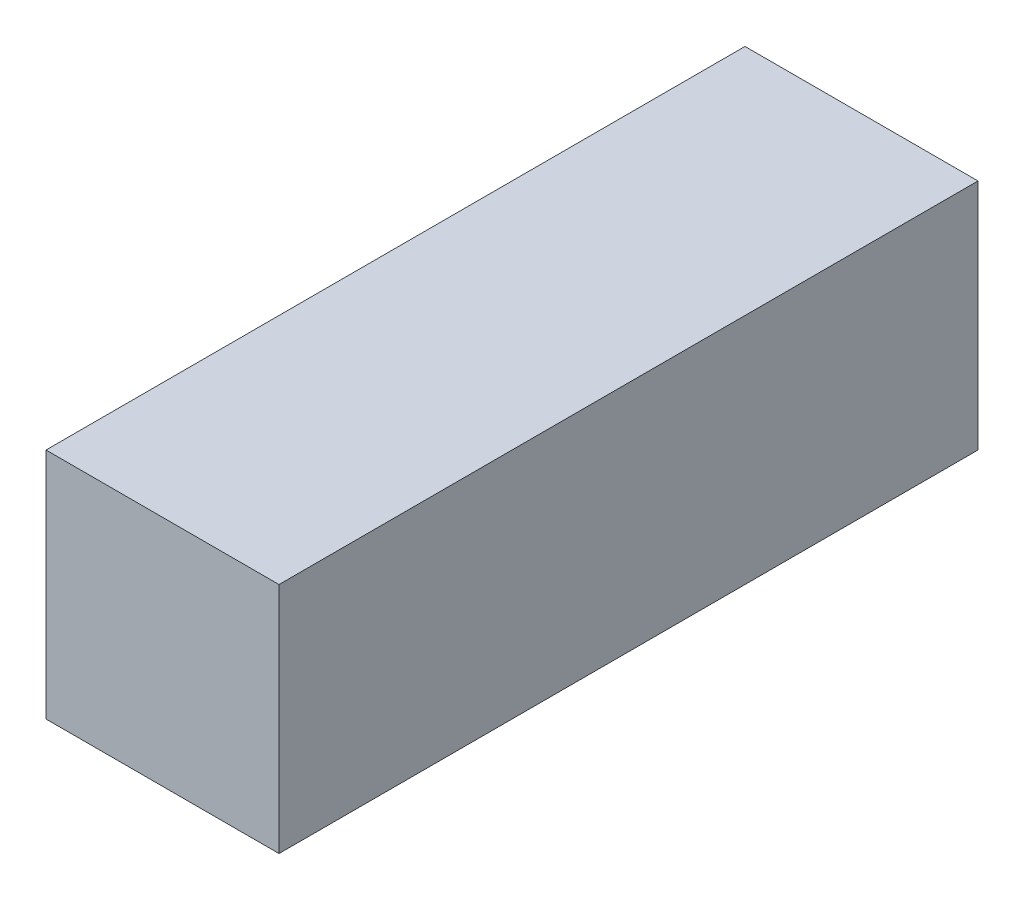
ISO-10303-21;
HEADER;
FILE_DESCRIPTION(('STEP AP214'),'2;1');
FILE_NAME('part.step','',(''),(''),'','','');
FILE_SCHEMA(('AUTOMOTIVE_DESIGN { 1 0 10303 214 1 1 1 1 }'));
ENDSEC;
DATA;
#1=APPLICATION_CONTEXT('core data for automotive mechanical design processes');
#2=APPLICATION_PROTOCOL_DEFINITION('international standard','automotive_design',2000,#1);
#3=PRODUCT_CONTEXT('',#1,'mechanical');
#4=PRODUCT('Part','Part','',(#3));
#5=PRODUCT_RELATED_PRODUCT_CATEGORY('part','',(#4));
#6=PRODUCT_DEFINITION_FORMATION('','',#4);
#7=PRODUCT_DEFINITION_CONTEXT('part definition',#1,'design');
#8=PRODUCT_DEFINITION('design','',#6,#7);
#9=PRODUCT_DEFINITION_SHAPE('','',#8);
#10=(LENGTH_UNIT() NAMED_UNIT(*) SI_UNIT(.MILLI.,.METRE.));
#11=(NAMED_UNIT(*) PLANE_ANGLE_UNIT() SI_UNIT($,.RADIAN.));
#12=(NAMED_UNIT(*) SI_UNIT($,.STERADIAN.) SOLID_ANGLE_UNIT());
#13=UNCERTAINTY_MEASURE_WITH_UNIT(LENGTH_MEASURE(1.E-05),#10,'distance_accuracy_value','');
#14=(GEOMETRIC_REPRESENTATION_CONTEXT(3) GLOBAL_UNCERTAINTY_ASSIGNED_CONTEXT((#13)) GLOBAL_UNIT_ASSIGNED_CONTEXT((#10,
#11,#12)) REPRESENTATION_CONTEXT('',''));
#15=CARTESIAN_POINT('',(0.,0.,0.));
#16=DIRECTION('',(0.,0.,1.));
#17=DIRECTION('',(1.,0.,0.));
#18=AXIS2_PLACEMENT_3D('',#15,#16,#17);
#19=CARTESIAN_POINT('',(-41.7218543046357,26.4900662251656,300.));
#20=DIRECTION('',(1.,0.,0.));
#21=DIRECTION('',(0.,1.,0.));
#22=AXIS2_PLACEMENT_3D('',#19,#20,#21);
#23=PLANE('',#22);
#24=DIRECTION('',(0.,-1.,0.));
#25=VECTOR('',#24,1.);
#26=CARTESIAN_POINT('',(-41.7218543046357,26.4900662251656,0.));
#27=LINE('',#26,#25);
#28=CARTESIAN_POINT('',(-41.7218543046357,26.4900662251656,0.));
#29=VERTEX_POINT('',#28);
#30=CARTESIAN_POINT('',(-41.7218543046357,-73.5099337748344,0.));
#31=VERTEX_POINT('',#30);
#32=EDGE_CURVE('E99',#29,#31,#27,.T.);
#33=ORIENTED_EDGE('',*,*,#32,.T.);
#34=DIRECTION('',(0.,0.,-1.));
#35=VECTOR('',#34,1.);
#36=CARTESIAN_POINT('',(-41.7218543046357,-73.5099337748344,300.));
#37=LINE('',#36,#35);
#38=CARTESIAN_POINT('',(-41.7218543046357,-73.5099337748344,300.));
#39=VERTEX_POINT('',#38);
#40=EDGE_CURVE('E11',#39,#31,#37,.T.);
#41=ORIENTED_EDGE('',*,*,#40,.F.);
#42=DIRECTION('',(0.,-1.,0.));
#43=VECTOR('',#42,1.);
#44=CARTESIAN_POINT('',(-41.7218543046357,26.4900662251656,300.));
#45=LINE('',#44,#43);
#46=CARTESIAN_POINT('',(-41.7218543046357,26.4900662251656,300.));
#47=VERTEX_POINT('',#46);
#48=EDGE_CURVE('E87',#47,#39,#45,.T.);
#49=ORIENTED_EDGE('',*,*,#48,.F.);
#50=DIRECTION('',(0.,0.,-1.));
#51=VECTOR('',#50,1.);
#52=CARTESIAN_POINT('',(-41.7218543046357,26.4900662251656,300.));
#53=LINE('',#52,#51);
#54=EDGE_CURVE('E95',#47,#29,#53,.T.);
#55=ORIENTED_EDGE('',*,*,#54,.T.);
#56=EDGE_LOOP('',(#33,#41,#49,#55));
#57=FACE_BOUND('',#56,.T.);
#58=ADVANCED_FACE('F36',(#57),#23,.F.);
#59=CARTESIAN_POINT('',(-41.7218543046357,-73.5099337748344,300.));
#60=DIRECTION('',(0.,1.,0.));
#61=DIRECTION('',(0.,0.,1.));
#62=AXIS2_PLACEMENT_3D('',#59,#60,#61);
#63=PLANE('',#62);
#64=DIRECTION('',(1.,0.,0.));
#65=VECTOR('',#64,1.);
#66=CARTESIAN_POINT('',(-41.7218543046357,-73.5099337748344,0.));
#67=LINE('',#66,#65);
#68=CARTESIAN_POINT('',(58.2781456953643,-73.5099337748344,0.));
#69=VERTEX_POINT('',#68);
#70=EDGE_CURVE('E91',#31,#69,#67,.T.);
#71=ORIENTED_EDGE('',*,*,#70,.T.);
#72=DIRECTION('',(0.,0.,-1.));
#73=VECTOR('',#72,1.);
#74=CARTESIAN_POINT('',(58.2781456953643,-73.5099337748344,300.));
#75=LINE('',#74,#73);
#76=CARTESIAN_POINT('',(58.2781456953643,-73.5099337748344,300.));
#77=VERTEX_POINT('',#76);
#78=EDGE_CURVE('E44',#77,#69,#75,.T.);
#79=ORIENTED_EDGE('',*,*,#78,.F.);
#80=DIRECTION('',(1.,0.,0.));
#81=VECTOR('',#80,1.);
#82=CARTESIAN_POINT('',(-41.7218543046357,-73.5099337748344,300.));
#83=LINE('',#82,#81);
#84=EDGE_CURVE('E82',#39,#77,#83,.T.);
#85=ORIENTED_EDGE('',*,*,#84,.F.);
#86=ORIENTED_EDGE('',*,*,#40,.T.);
#87=EDGE_LOOP('',(#71,#79,#85,#86));
#88=FACE_BOUND('',#87,.T.);
#89=ADVANCED_FACE('F90',(#88),#63,.F.);
#90=CARTESIAN_POINT('',(58.2781456953643,26.4900662251656,300.));
#91=DIRECTION('',(-1.,0.,0.));
#92=DIRECTION('',(0.,-1.,0.));
#93=AXIS2_PLACEMENT_3D('',#90,#91,#92);
#94=PLANE('',#93);
#95=DIRECTION('',(0.,1.,0.));
#96=VECTOR('',#95,1.);
#97=CARTESIAN_POINT('',(58.2781456953643,26.4900662251656,0.));
#98=LINE('',#97,#96);
#99=CARTESIAN_POINT('',(58.2781456953643,26.4900662251656,0.));
#100=VERTEX_POINT('',#99);
#101=EDGE_CURVE('E69',#69,#100,#98,.T.);
#102=ORIENTED_EDGE('',*,*,#101,.T.);
#103=DIRECTION('',(0.,0.,-1.));
#104=VECTOR('',#103,1.);
#105=CARTESIAN_POINT('',(58.2781456953643,26.4900662251656,300.));
#106=LINE('',#105,#104);
#107=CARTESIAN_POINT('',(58.2781456953643,26.4900662251656,300.));
#108=VERTEX_POINT('',#107);
#109=EDGE_CURVE('E92',#108,#100,#106,.T.);
#110=ORIENTED_EDGE('',*,*,#109,.F.);
#111=DIRECTION('',(0.,1.,0.));
#112=VECTOR('',#111,1.);
#113=CARTESIAN_POINT('',(58.2781456953643,26.4900662251656,300.));
#114=LINE('',#113,#112);
#115=EDGE_CURVE('E85',#77,#108,#114,.T.);
#116=ORIENTED_EDGE('',*,*,#115,.F.);
#117=ORIENTED_EDGE('',*,*,#78,.T.);
#118=EDGE_LOOP('',(#102,#110,#116,#117));
#119=FACE_BOUND('',#118,.T.);
#120=ADVANCED_FACE('F93',(#119),#94,.F.);
#121=CARTESIAN_POINT('',(-41.7218543046357,26.4900662251656,300.));
#122=DIRECTION('',(0.,-1.,0.));
#123=DIRECTION('',(0.,0.,-1.));
#124=AXIS2_PLACEMENT_3D('',#121,#122,#123);
#125=PLANE('',#124);
#126=DIRECTION('',(-1.,0.,0.));
#127=VECTOR('',#126,1.);
#128=CARTESIAN_POINT('',(-41.7218543046357,26.4900662251656,0.));
#129=LINE('',#128,#127);
#130=EDGE_CURVE('E75',#100,#29,#129,.T.);
#131=ORIENTED_EDGE('',*,*,#130,.T.);
#132=ORIENTED_EDGE('',*,*,#54,.F.);
#133=DIRECTION('',(-1.,0.,0.));
#134=VECTOR('',#133,1.);
#135=CARTESIAN_POINT('',(-41.7218543046357,26.4900662251656,300.));
#136=LINE('',#135,#134);
#137=EDGE_CURVE('E52',#108,#47,#136,.T.);
#138=ORIENTED_EDGE('',*,*,#137,.F.);
#139=ORIENTED_EDGE('',*,*,#109,.T.);
#140=EDGE_LOOP('',(#131,#132,#138,#139));
#141=FACE_BOUND('',#140,.T.);
#142=ADVANCED_FACE('F106',(#141),#125,.F.);
#143=CARTESIAN_POINT('',(0.,0.,300.));
#144=DIRECTION('',(0.,0.,1.));
#145=DIRECTION('',(1.,0.,0.));
#146=AXIS2_PLACEMENT_3D('',#143,#144,#145);
#147=PLANE('',#146);
#148=ORIENTED_EDGE('',*,*,#48,.T.);
#149=ORIENTED_EDGE('',*,*,#84,.T.);
#150=ORIENTED_EDGE('',*,*,#115,.T.);
#151=ORIENTED_EDGE('',*,*,#137,.T.);
#152=EDGE_LOOP('',(#148,#149,#150,#151));
#153=FACE_BOUND('',#152,.T.);
#154=ADVANCED_FACE('F83',(#153),#147,.T.);
#155=CARTESIAN_POINT('',(0.,0.,0.));
#156=DIRECTION('',(0.,0.,1.));
#157=DIRECTION('',(1.,0.,0.));
#158=AXIS2_PLACEMENT_3D('',#155,#156,#157);
#159=PLANE('',#158);
#160=ORIENTED_EDGE('',*,*,#32,.F.);
#161=ORIENTED_EDGE('',*,*,#130,.F.);
#162=ORIENTED_EDGE('',*,*,#101,.F.);
#163=ORIENTED_EDGE('',*,*,#70,.F.);
#164=EDGE_LOOP('',(#160,#161,#162,#163));
#165=FACE_BOUND('',#164,.T.);
#166=ADVANCED_FACE('F109',(#165),#159,.F.);
#167=CLOSED_SHELL('',(#58,#89,#120,#142,#154,#166));
#168=MANIFOLD_SOLID_BREP('B2',#167);
#169=ADVANCED_BREP_SHAPE_REPRESENTATION('',(#18,#168),#14);
#170=SHAPE_DEFINITION_REPRESENTATION(#9,#169);
ENDSEC;
END-ISO-10303-21;
